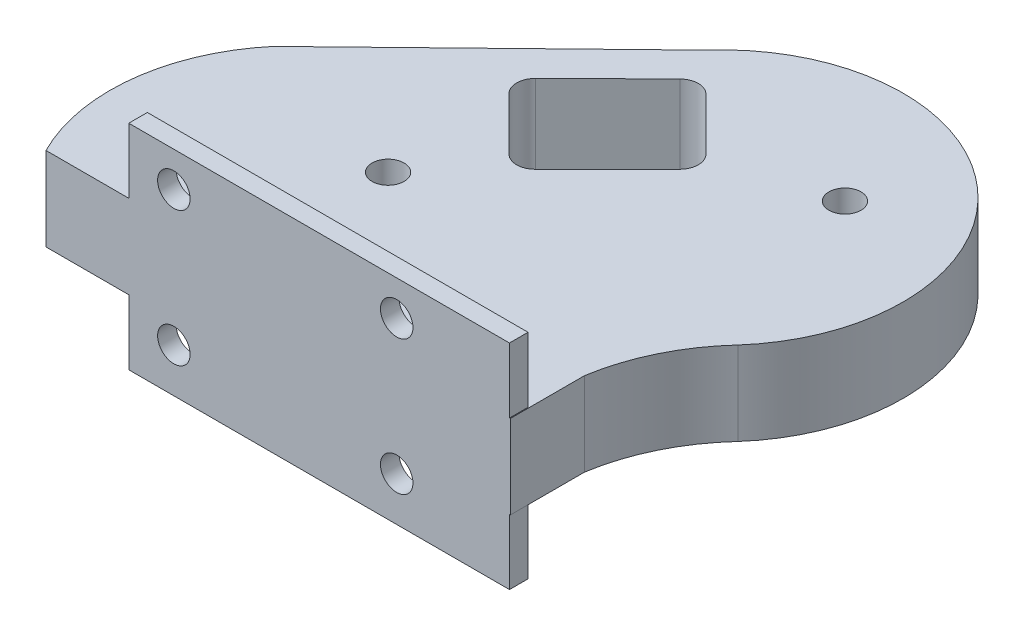
ISO-10303-21;
HEADER;
FILE_DESCRIPTION(('STEP AP214'),'2;1');
FILE_NAME('part.step','',(''),(''),'','','');
FILE_SCHEMA(('AUTOMOTIVE_DESIGN { 1 0 10303 214 1 1 1 1 }'));
ENDSEC;
DATA;
#1=APPLICATION_CONTEXT('core data for automotive mechanical design processes');
#2=APPLICATION_PROTOCOL_DEFINITION('international standard','automotive_design',2000,#1);
#3=PRODUCT_CONTEXT('',#1,'mechanical');
#4=PRODUCT('Part','Part','',(#3));
#5=PRODUCT_RELATED_PRODUCT_CATEGORY('part','',(#4));
#6=PRODUCT_DEFINITION_FORMATION('','',#4);
#7=PRODUCT_DEFINITION_CONTEXT('part definition',#1,'design');
#8=PRODUCT_DEFINITION('design','',#6,#7);
#9=PRODUCT_DEFINITION_SHAPE('','',#8);
#10=(LENGTH_UNIT() NAMED_UNIT(*) SI_UNIT(.MILLI.,.METRE.));
#11=(NAMED_UNIT(*) PLANE_ANGLE_UNIT() SI_UNIT($,.RADIAN.));
#12=(NAMED_UNIT(*) SI_UNIT($,.STERADIAN.) SOLID_ANGLE_UNIT());
#13=UNCERTAINTY_MEASURE_WITH_UNIT(LENGTH_MEASURE(1.E-05),#10,'distance_accuracy_value','');
#14=(GEOMETRIC_REPRESENTATION_CONTEXT(3) GLOBAL_UNCERTAINTY_ASSIGNED_CONTEXT((#13)) GLOBAL_UNIT_ASSIGNED_CONTEXT((#10,
#11,#12)) REPRESENTATION_CONTEXT('',''));
#15=CARTESIAN_POINT('',(0.,0.,0.));
#16=DIRECTION('',(0.,0.,1.));
#17=DIRECTION('',(1.,0.,0.));
#18=AXIS2_PLACEMENT_3D('',#15,#16,#17);
#19=CARTESIAN_POINT('',(17.8501478662486,9.,-9.05723294704562));
#20=DIRECTION('',(0.,-1.,0.));
#21=DIRECTION('',(0.,0.,-1.));
#22=AXIS2_PLACEMENT_3D('',#19,#20,#21);
#23=PLANE('',#22);
#24=DIRECTION('',(0.707106781186548,0.,0.707106781186548));
#25=VECTOR('',#24,1.);
#26=CARTESIAN_POINT('',(26.6861026309434,9.,-23.1742490338568));
#27=LINE('',#26,#25);
#28=CARTESIAN_POINT('',(19.62427187537,9.,-30.2360797894303));
#29=VERTEX_POINT('',#28);
#30=CARTESIAN_POINT('',(25.2718890685703,9.,-24.5884625962299));
#31=VERTEX_POINT('',#30);
#32=EDGE_CURVE('E347',#29,#31,#27,.T.);
#33=ORIENTED_EDGE('',*,*,#32,.F.);
#34=CARTESIAN_POINT('',(21.0384854377431,9.,-31.6502933518034));
#35=DIRECTION('',(0.,-1.,0.));
#36=DIRECTION('',(0.,0.,-1.));
#37=AXIS2_PLACEMENT_3D('',#34,#35,#36);
#38=CIRCLE('',#37,2.);
#39=CARTESIAN_POINT('',(19.6335087359109,9.,-33.0736838348785));
#40=VERTEX_POINT('',#39);
#41=EDGE_CURVE('E318',#29,#40,#38,.T.);
#42=ORIENTED_EDGE('',*,*,#41,.T.);
#43=DIRECTION('',(-0.71169524153756,0.,0.702488350916081));
#44=VECTOR('',#43,1.);
#45=CARTESIAN_POINT('',(18.2008212567049,9.,-31.6595304080954));
#46=LINE('',#45,#44);
#47=CARTESIAN_POINT('',(27.4620960627533,9.,-40.8009961453483));
#48=VERTEX_POINT('',#47);
#49=EDGE_CURVE('E328',#48,#40,#46,.T.);
#50=ORIENTED_EDGE('',*,*,#49,.F.);
#51=CARTESIAN_POINT('',(28.8670727645854,9.,-39.3776056622732));
#52=DIRECTION('',(0.,-1.,0.));
#53=DIRECTION('',(0.,0.,-1.));
#54=AXIS2_PLACEMENT_3D('',#51,#52,#53);
#55=CIRCLE('',#54,2.);
#56=CARTESIAN_POINT('',(30.2812863269585,9.,-40.7918192246463));
#57=VERTEX_POINT('',#56);
#58=EDGE_CURVE('E44',#48,#57,#55,.T.);
#59=ORIENTED_EDGE('',*,*,#58,.T.);
#60=DIRECTION('',(-0.707106781186547,0.,-0.707106781186548));
#61=VECTOR('',#60,1.);
#62=CARTESIAN_POINT('',(28.8762498797683,9.,-42.1968556718366));
#63=LINE('',#62,#61);
#64=CARTESIAN_POINT('',(35.8782660119726,9.,-35.1948395396322));
#65=VERTEX_POINT('',#64);
#66=EDGE_CURVE('E327',#65,#57,#63,.T.);
#67=ORIENTED_EDGE('',*,*,#66,.F.);
#68=CARTESIAN_POINT('',(34.4640524495995,9.,-33.7806259772591));
#69=DIRECTION('',(0.,-1.,0.));
#70=DIRECTION('',(0.,0.,-1.));
#71=AXIS2_PLACEMENT_3D('',#68,#69,#70);
#72=CIRCLE('',#71,2.);
#73=CARTESIAN_POINT('',(35.8782660119726,9.,-32.366412414886));
#74=VERTEX_POINT('',#73);
#75=EDGE_CURVE('E310',#65,#74,#72,.T.);
#76=ORIENTED_EDGE('',*,*,#75,.T.);
#77=DIRECTION('',(0.707106781186547,0.,-0.707106781186548));
#78=VECTOR('',#77,1.);
#79=CARTESIAN_POINT('',(37.2924795743457,9.,-33.7806259772591));
#80=LINE('',#79,#78);
#81=CARTESIAN_POINT('',(28.1003161933165,9.,-24.5884625962299));
#82=VERTEX_POINT('',#81);
#83=EDGE_CURVE('E341',#82,#74,#80,.T.);
#84=ORIENTED_EDGE('',*,*,#83,.F.);
#85=CARTESIAN_POINT('',(26.6861026309434,9.,-26.002676158603));
#86=DIRECTION('',(0.,-1.,0.));
#87=DIRECTION('',(0.,0.,-1.));
#88=AXIS2_PLACEMENT_3D('',#85,#86,#87);
#89=CIRCLE('',#88,2.);
#90=EDGE_CURVE('E314',#82,#31,#89,.T.);
#91=ORIENTED_EDGE('',*,*,#90,.T.);
#92=EDGE_LOOP('',(#33,#42,#50,#59,#67,#76,#84,#91));
#93=FACE_BOUND('',#92,.T.);
#94=CARTESIAN_POINT('',(20.4484847223724,9.,-16.3926586079706));
#95=DIRECTION('',(0.,1.,0.));
#96=DIRECTION('',(0.,0.,1.));
#97=AXIS2_PLACEMENT_3D('',#94,#95,#96);
#98=CIRCLE('',#97,1.725);
#99=CARTESIAN_POINT('',(20.4484847223724,9.,-14.6676586079706));
#100=VERTEX_POINT('',#99);
#101=EDGE_CURVE('E356',#100,#100,#98,.T.);
#102=ORIENTED_EDGE('',*,*,#101,.F.);
#103=EDGE_LOOP('',(#102));
#104=FACE_BOUND('',#103,.T.);
#105=CARTESIAN_POINT('',(47.7410163395076,9.,-38.3042472753328));
#106=DIRECTION('',(0.,1.,0.));
#107=DIRECTION('',(0.,0.,1.));
#108=AXIS2_PLACEMENT_3D('',#105,#106,#107);
#109=CIRCLE('',#108,1.725);
#110=CARTESIAN_POINT('',(47.7410163395076,9.,-36.5792472753328));
#111=VERTEX_POINT('',#110);
#112=EDGE_CURVE('E353',#111,#111,#109,.T.);
#113=ORIENTED_EDGE('',*,*,#112,.F.);
#114=EDGE_LOOP('',(#113));
#115=FACE_BOUND('',#114,.T.);
#116=DIRECTION('',(0.,0.,1.));
#117=VECTOR('',#116,1.);
#118=CARTESIAN_POINT('',(8.9130109246541,9.,-2.));
#119=LINE('',#118,#117);
#120=CARTESIAN_POINT('',(8.9130109246541,9.,-2.));
#121=VERTEX_POINT('',#120);
#122=CARTESIAN_POINT('',(8.9130109246541,9.,0.));
#123=VERTEX_POINT('',#122);
#124=EDGE_CURVE('E201',#121,#123,#119,.T.);
#125=ORIENTED_EDGE('',*,*,#124,.F.);
#126=DIRECTION('',(1.,0.,0.));
#127=VECTOR('',#126,1.);
#128=CARTESIAN_POINT('',(8.9130109246541,9.,-2.));
#129=LINE('',#128,#127);
#130=CARTESIAN_POINT('',(49.9130109246541,9.00000000000001,-2.));
#131=VERTEX_POINT('',#130);
#132=EDGE_CURVE('E186',#121,#131,#129,.T.);
#133=ORIENTED_EDGE('',*,*,#132,.T.);
#134=DIRECTION('',(0.,0.,1.));
#135=VECTOR('',#134,1.);
#136=CARTESIAN_POINT('',(49.9130109246541,9.00000000000001,-2.));
#137=LINE('',#136,#135);
#138=CARTESIAN_POINT('',(49.9130109246541,9.,0.));
#139=VERTEX_POINT('',#138);
#140=EDGE_CURVE('E209',#131,#139,#137,.T.);
#141=ORIENTED_EDGE('',*,*,#140,.T.);
#142=DIRECTION('',(1.,0.,0.));
#143=VECTOR('',#142,1.);
#144=CARTESIAN_POINT('',(0.,9.,0.));
#145=LINE('',#144,#143);
#146=CARTESIAN_POINT('',(50.,9.,0.));
#147=VERTEX_POINT('',#146);
#148=EDGE_CURVE('E249',#139,#147,#145,.T.);
#149=ORIENTED_EDGE('',*,*,#148,.T.);
#150=DIRECTION('',(0.,0.,-1.));
#151=VECTOR('',#150,1.);
#152=CARTESIAN_POINT('',(50.,9.,0.));
#153=LINE('',#152,#151);
#154=CARTESIAN_POINT('',(50.,9.,-8.));
#155=VERTEX_POINT('',#154);
#156=EDGE_CURVE('E252',#147,#155,#153,.T.);
#157=ORIENTED_EDGE('',*,*,#156,.T.);
#158=CARTESIAN_POINT('',(71.175111147569,9.,-4.5795657374805));
#159=DIRECTION('',(0.,-1.,0.));
#160=DIRECTION('',(0.,0.,-1.));
#161=AXIS2_PLACEMENT_3D('',#158,#159,#160);
#162=CIRCLE('',#161,21.4495851394874);
#163=CARTESIAN_POINT('',(55.3975684306176,9.,-19.1106995016054));
#164=VERTEX_POINT('',#163);
#165=EDGE_CURVE('E254',#155,#164,#162,.T.);
#166=ORIENTED_EDGE('',*,*,#165,.T.);
#167=CARTESIAN_POINT('',(40.8067017302212,9.,-32.0203140719151));
#168=DIRECTION('',(0.,1.,0.));
#169=DIRECTION('',(0.,0.,-1.));
#170=AXIS2_PLACEMENT_3D('',#167,#168,#169);
#171=CIRCLE('',#170,19.4820825227358);
#172=CARTESIAN_POINT('',(26.2158350298248,9.,-44.9299286422246));
#173=VERTEX_POINT('',#172);
#174=EDGE_CURVE('E256',#164,#173,#171,.T.);
#175=ORIENTED_EDGE('',*,*,#174,.T.);
#176=DIRECTION('',(-0.717581512482861,0.,0.696474531438738));
#177=VECTOR('',#176,1.);
#178=CARTESIAN_POINT('',(2.53564511789033,9.,-21.9462691047463));
#179=LINE('',#178,#177);
#180=CARTESIAN_POINT('',(2.53564511789033,9.,-21.9462691047463));
#181=VERTEX_POINT('',#180);
#182=EDGE_CURVE('E258',#173,#181,#179,.T.);
#183=ORIENTED_EDGE('',*,*,#182,.T.);
#184=CARTESIAN_POINT('',(17.8501478662486,9.,-9.05723294704562));
#185=DIRECTION('',(0.,1.,0.));
#186=DIRECTION('',(0.,0.,-1.));
#187=AXIS2_PLACEMENT_3D('',#184,#185,#186);
#188=CIRCLE('',#187,20.0165243612368);
#189=CARTESIAN_POINT('',(0.,9.,0.));
#190=VERTEX_POINT('',#189);
#191=EDGE_CURVE('E247',#181,#190,#188,.T.);
#192=ORIENTED_EDGE('',*,*,#191,.T.);
#193=EDGE_CURVE('E208',#190,#123,#145,.T.);
#194=ORIENTED_EDGE('',*,*,#193,.T.);
#195=EDGE_LOOP('',(#125,#133,#141,#149,#157,#166,#175,#183,#192,#194));
#196=FACE_BOUND('',#195,.T.);
#197=ADVANCED_FACE('F36',(#93,#104,#115,#196),#23,.F.);
#198=CARTESIAN_POINT('',(17.8501478662486,9.,-9.05723294704562));
#199=DIRECTION('',(0.,-1.,0.));
#200=DIRECTION('',(0.,0.,-1.));
#201=AXIS2_PLACEMENT_3D('',#198,#199,#200);
#202=CYLINDRICAL_SURFACE('',#201,20.0165243612368);
#203=CARTESIAN_POINT('',(17.8501478662486,0.,-9.05723294704562));
#204=DIRECTION('',(0.,1.,0.));
#205=DIRECTION('',(0.,0.,-1.));
#206=AXIS2_PLACEMENT_3D('',#203,#204,#205);
#207=CIRCLE('',#206,20.0165243612368);
#208=CARTESIAN_POINT('',(2.53564511789033,0.,-21.9462691047463));
#209=VERTEX_POINT('',#208);
#210=CARTESIAN_POINT('',(0.,0.,0.));
#211=VERTEX_POINT('',#210);
#212=EDGE_CURVE('E241',#209,#211,#207,.T.);
#213=ORIENTED_EDGE('',*,*,#212,.T.);
#214=DIRECTION('',(0.,-1.,0.));
#215=VECTOR('',#214,1.);
#216=CARTESIAN_POINT('',(0.,9.,0.));
#217=LINE('',#216,#215);
#218=EDGE_CURVE('E288',#190,#211,#217,.T.);
#219=ORIENTED_EDGE('',*,*,#218,.F.);
#220=ORIENTED_EDGE('',*,*,#191,.F.);
#221=DIRECTION('',(0.,-1.,0.));
#222=VECTOR('',#221,1.);
#223=CARTESIAN_POINT('',(2.53564511789033,9.,-21.9462691047463));
#224=LINE('',#223,#222);
#225=EDGE_CURVE('E260',#181,#209,#224,.T.);
#226=ORIENTED_EDGE('',*,*,#225,.T.);
#227=EDGE_LOOP('',(#213,#219,#220,#226));
#228=FACE_BOUND('',#227,.T.);
#229=ADVANCED_FACE('F413',(#228),#202,.T.);
#230=CARTESIAN_POINT('',(0.,9.,0.));
#231=DIRECTION('',(0.,0.,-1.));
#232=DIRECTION('',(-1.,0.,0.));
#233=AXIS2_PLACEMENT_3D('',#230,#231,#232);
#234=PLANE('',#233);
#235=CARTESIAN_POINT('',(13.7694483975875,12.2365251411092,0.));
#236=DIRECTION('',(0.,0.,-1.));
#237=DIRECTION('',(-1.,0.,0.));
#238=AXIS2_PLACEMENT_3D('',#235,#236,#237);
#239=CIRCLE('',#238,1.75);
#240=CARTESIAN_POINT('',(12.0194483975875,12.2365251411092,0.));
#241=VERTEX_POINT('',#240);
#242=EDGE_CURVE('E381',#241,#241,#239,.T.);
#243=ORIENTED_EDGE('',*,*,#242,.T.);
#244=EDGE_LOOP('',(#243));
#245=FACE_BOUND('',#244,.T.);
#246=CARTESIAN_POINT('',(37.7694483975875,12.236525141109,0.));
#247=DIRECTION('',(0.,0.,-1.));
#248=DIRECTION('',(-1.,0.,0.));
#249=AXIS2_PLACEMENT_3D('',#246,#247,#248);
#250=CIRCLE('',#249,1.75);
#251=CARTESIAN_POINT('',(36.0194483975875,12.236525141109,0.));
#252=VERTEX_POINT('',#251);
#253=EDGE_CURVE('E375',#252,#252,#250,.T.);
#254=ORIENTED_EDGE('',*,*,#253,.T.);
#255=EDGE_LOOP('',(#254));
#256=FACE_BOUND('',#255,.T.);
#257=CARTESIAN_POINT('',(37.7694483975874,-2.26347485889099,0.));
#258=DIRECTION('',(0.,0.,-1.));
#259=DIRECTION('',(-1.,0.,0.));
#260=AXIS2_PLACEMENT_3D('',#257,#258,#259);
#261=CIRCLE('',#260,1.75);
#262=CARTESIAN_POINT('',(36.0194483975874,-2.26347485889099,0.));
#263=VERTEX_POINT('',#262);
#264=EDGE_CURVE('E368',#263,#263,#261,.T.);
#265=ORIENTED_EDGE('',*,*,#264,.T.);
#266=EDGE_LOOP('',(#265));
#267=FACE_BOUND('',#266,.T.);
#268=CARTESIAN_POINT('',(13.7694483975874,-2.26347485889082,0.));
#269=DIRECTION('',(0.,0.,-1.));
#270=DIRECTION('',(-1.,0.,0.));
#271=AXIS2_PLACEMENT_3D('',#268,#269,#270);
#272=CIRCLE('',#271,1.75);
#273=CARTESIAN_POINT('',(12.0194483975874,-2.26347485889082,0.));
#274=VERTEX_POINT('',#273);
#275=EDGE_CURVE('E386',#274,#274,#272,.T.);
#276=ORIENTED_EDGE('',*,*,#275,.T.);
#277=EDGE_LOOP('',(#276));
#278=FACE_BOUND('',#277,.T.);
#279=DIRECTION('',(1.,0.,0.));
#280=VECTOR('',#279,1.);
#281=CARTESIAN_POINT('',(0.,0.,0.));
#282=LINE('',#281,#280);
#283=CARTESIAN_POINT('',(8.9130109246541,0.,0.));
#284=VERTEX_POINT('',#283);
#285=EDGE_CURVE('E264',#211,#284,#282,.T.);
#286=ORIENTED_EDGE('',*,*,#285,.T.);
#287=DIRECTION('',(0.,-1.,0.));
#288=VECTOR('',#287,1.);
#289=CARTESIAN_POINT('',(8.9130109246541,-7.,0.));
#290=LINE('',#289,#288);
#291=CARTESIAN_POINT('',(8.9130109246541,-7.,0.));
#292=VERTEX_POINT('',#291);
#293=EDGE_CURVE('E230',#284,#292,#290,.T.);
#294=ORIENTED_EDGE('',*,*,#293,.T.);
#295=DIRECTION('',(1.,0.,0.));
#296=VECTOR('',#295,1.);
#297=CARTESIAN_POINT('',(8.9130109246541,-7.,0.));
#298=LINE('',#297,#296);
#299=CARTESIAN_POINT('',(49.9130109246541,-7.,0.));
#300=VERTEX_POINT('',#299);
#301=EDGE_CURVE('E233',#292,#300,#298,.T.);
#302=ORIENTED_EDGE('',*,*,#301,.T.);
#303=DIRECTION('',(0.,1.,0.));
#304=VECTOR('',#303,1.);
#305=CARTESIAN_POINT('',(49.9130109246541,-7.,0.));
#306=LINE('',#305,#304);
#307=CARTESIAN_POINT('',(49.9130109246541,0.,0.));
#308=VERTEX_POINT('',#307);
#309=EDGE_CURVE('E221',#300,#308,#306,.T.);
#310=ORIENTED_EDGE('',*,*,#309,.T.);
#311=CARTESIAN_POINT('',(50.,0.,0.));
#312=VERTEX_POINT('',#311);
#313=EDGE_CURVE('E263',#308,#312,#282,.T.);
#314=ORIENTED_EDGE('',*,*,#313,.T.);
#315=DIRECTION('',(0.,-1.,0.));
#316=VECTOR('',#315,1.);
#317=CARTESIAN_POINT('',(50.,9.,0.));
#318=LINE('',#317,#316);
#319=EDGE_CURVE('E285',#147,#312,#318,.T.);
#320=ORIENTED_EDGE('',*,*,#319,.F.);
#321=ORIENTED_EDGE('',*,*,#148,.F.);
#322=DIRECTION('',(0.,1.,0.));
#323=VECTOR('',#322,1.);
#324=CARTESIAN_POINT('',(49.9130109246541,16.,0.));
#325=LINE('',#324,#323);
#326=CARTESIAN_POINT('',(49.9130109246541,16.,0.));
#327=VERTEX_POINT('',#326);
#328=EDGE_CURVE('E394',#139,#327,#325,.T.);
#329=ORIENTED_EDGE('',*,*,#328,.T.);
#330=DIRECTION('',(-1.,0.,0.));
#331=VECTOR('',#330,1.);
#332=CARTESIAN_POINT('',(8.9130109246541,16.,0.));
#333=LINE('',#332,#331);
#334=CARTESIAN_POINT('',(8.9130109246541,16.,0.));
#335=VERTEX_POINT('',#334);
#336=EDGE_CURVE('E204',#327,#335,#333,.T.);
#337=ORIENTED_EDGE('',*,*,#336,.T.);
#338=DIRECTION('',(0.,-1.,0.));
#339=VECTOR('',#338,1.);
#340=CARTESIAN_POINT('',(8.9130109246541,16.,0.));
#341=LINE('',#340,#339);
#342=EDGE_CURVE('E389',#335,#123,#341,.T.);
#343=ORIENTED_EDGE('',*,*,#342,.T.);
#344=ORIENTED_EDGE('',*,*,#193,.F.);
#345=ORIENTED_EDGE('',*,*,#218,.T.);
#346=EDGE_LOOP('',(#286,#294,#302,#310,#314,#320,#321,#329,#337,#343,#344,#345));
#347=FACE_BOUND('',#346,.T.);
#348=ADVANCED_FACE('F405',(#245,#256,#267,#278,#347),#234,.F.);
#349=CARTESIAN_POINT('',(50.,9.,0.));
#350=DIRECTION('',(-1.,0.,0.));
#351=DIRECTION('',(0.,0.,1.));
#352=AXIS2_PLACEMENT_3D('',#349,#350,#351);
#353=PLANE('',#352);
#354=DIRECTION('',(0.,0.,-1.));
#355=VECTOR('',#354,1.);
#356=CARTESIAN_POINT('',(50.,0.,0.));
#357=LINE('',#356,#355);
#358=CARTESIAN_POINT('',(50.,0.,-8.));
#359=VERTEX_POINT('',#358);
#360=EDGE_CURVE('E267',#312,#359,#357,.T.);
#361=ORIENTED_EDGE('',*,*,#360,.T.);
#362=DIRECTION('',(0.,-1.,0.));
#363=VECTOR('',#362,1.);
#364=CARTESIAN_POINT('',(50.,9.,-8.));
#365=LINE('',#364,#363);
#366=EDGE_CURVE('E282',#155,#359,#365,.T.);
#367=ORIENTED_EDGE('',*,*,#366,.F.);
#368=ORIENTED_EDGE('',*,*,#156,.F.);
#369=ORIENTED_EDGE('',*,*,#319,.T.);
#370=EDGE_LOOP('',(#361,#367,#368,#369));
#371=FACE_BOUND('',#370,.T.);
#372=ADVANCED_FACE('F436',(#371),#353,.F.);
#373=CARTESIAN_POINT('',(71.175111147569,9.,-4.5795657374805));
#374=DIRECTION('',(0.,-1.,0.));
#375=DIRECTION('',(0.,0.,-1.));
#376=AXIS2_PLACEMENT_3D('',#373,#374,#375);
#377=CYLINDRICAL_SURFACE('',#376,21.4495851394874);
#378=CARTESIAN_POINT('',(71.175111147569,0.,-4.5795657374805));
#379=DIRECTION('',(0.,-1.,0.));
#380=DIRECTION('',(0.,0.,-1.));
#381=AXIS2_PLACEMENT_3D('',#378,#379,#380);
#382=CIRCLE('',#381,21.4495851394874);
#383=CARTESIAN_POINT('',(55.3975684306176,0.,-19.1106995016054));
#384=VERTEX_POINT('',#383);
#385=EDGE_CURVE('E269',#359,#384,#382,.T.);
#386=ORIENTED_EDGE('',*,*,#385,.T.);
#387=DIRECTION('',(0.,-1.,0.));
#388=VECTOR('',#387,1.);
#389=CARTESIAN_POINT('',(55.3975684306176,9.,-19.1106995016054));
#390=LINE('',#389,#388);
#391=EDGE_CURVE('E279',#164,#384,#390,.T.);
#392=ORIENTED_EDGE('',*,*,#391,.F.);
#393=ORIENTED_EDGE('',*,*,#165,.F.);
#394=ORIENTED_EDGE('',*,*,#366,.T.);
#395=EDGE_LOOP('',(#386,#392,#393,#394));
#396=FACE_BOUND('',#395,.T.);
#397=ADVANCED_FACE('F440',(#396),#377,.F.);
#398=CARTESIAN_POINT('',(40.8067017302212,9.,-32.0203140719151));
#399=DIRECTION('',(0.,-1.,0.));
#400=DIRECTION('',(0.,0.,-1.));
#401=AXIS2_PLACEMENT_3D('',#398,#399,#400);
#402=CYLINDRICAL_SURFACE('',#401,19.4820825227358);
#403=CARTESIAN_POINT('',(40.8067017302212,0.,-32.0203140719151));
#404=DIRECTION('',(0.,1.,0.));
#405=DIRECTION('',(0.,0.,-1.));
#406=AXIS2_PLACEMENT_3D('',#403,#404,#405);
#407=CIRCLE('',#406,19.4820825227358);
#408=CARTESIAN_POINT('',(26.2158350298248,0.,-44.9299286422246));
#409=VERTEX_POINT('',#408);
#410=EDGE_CURVE('E271',#384,#409,#407,.T.);
#411=ORIENTED_EDGE('',*,*,#410,.T.);
#412=DIRECTION('',(0.,-1.,0.));
#413=VECTOR('',#412,1.);
#414=CARTESIAN_POINT('',(26.2158350298248,9.,-44.9299286422246));
#415=LINE('',#414,#413);
#416=EDGE_CURVE('E276',#173,#409,#415,.T.);
#417=ORIENTED_EDGE('',*,*,#416,.F.);
#418=ORIENTED_EDGE('',*,*,#174,.F.);
#419=ORIENTED_EDGE('',*,*,#391,.T.);
#420=EDGE_LOOP('',(#411,#417,#418,#419));
#421=FACE_BOUND('',#420,.T.);
#422=ADVANCED_FACE('F445',(#421),#402,.T.);
#423=CARTESIAN_POINT('',(2.53564511789033,9.,-21.9462691047463));
#424=DIRECTION('',(0.696474531438738,0.,0.717581512482861));
#425=DIRECTION('',(0.717581512482861,0.,-0.696474531438738));
#426=AXIS2_PLACEMENT_3D('',#423,#424,#425);
#427=PLANE('',#426);
#428=DIRECTION('',(-0.717581512482861,0.,0.696474531438738));
#429=VECTOR('',#428,1.);
#430=CARTESIAN_POINT('',(2.53564511789033,0.,-21.9462691047463));
#431=LINE('',#430,#429);
#432=EDGE_CURVE('E250',#409,#209,#431,.T.);
#433=ORIENTED_EDGE('',*,*,#432,.T.);
#434=ORIENTED_EDGE('',*,*,#225,.F.);
#435=ORIENTED_EDGE('',*,*,#182,.F.);
#436=ORIENTED_EDGE('',*,*,#416,.T.);
#437=EDGE_LOOP('',(#433,#434,#435,#436));
#438=FACE_BOUND('',#437,.T.);
#439=ADVANCED_FACE('F447',(#438),#427,.F.);
#440=CARTESIAN_POINT('',(17.8501478662486,0.,-9.05723294704562));
#441=DIRECTION('',(0.,-1.,0.));
#442=DIRECTION('',(0.,0.,-1.));
#443=AXIS2_PLACEMENT_3D('',#440,#441,#442);
#444=PLANE('',#443);
#445=DIRECTION('',(-0.707106781186547,0.,-0.707106781186548));
#446=VECTOR('',#445,1.);
#447=CARTESIAN_POINT('',(28.8762498797683,0.,-42.1968556718366));
#448=LINE('',#447,#446);
#449=CARTESIAN_POINT('',(35.8782660119726,0.,-35.1948395396322));
#450=VERTEX_POINT('',#449);
#451=CARTESIAN_POINT('',(30.2812863269585,0.,-40.7918192246463));
#452=VERTEX_POINT('',#451);
#453=EDGE_CURVE('E351',#450,#452,#448,.T.);
#454=ORIENTED_EDGE('',*,*,#453,.T.);
#455=CARTESIAN_POINT('',(28.8670727645854,0.,-39.3776056622732));
#456=DIRECTION('',(0.,-1.,0.));
#457=DIRECTION('',(0.,0.,-1.));
#458=AXIS2_PLACEMENT_3D('',#455,#456,#457);
#459=CIRCLE('',#458,2.);
#460=CARTESIAN_POINT('',(27.4620960627533,0.,-40.8009961453483));
#461=VERTEX_POINT('',#460);
#462=EDGE_CURVE('E11',#452,#461,#459,.F.);
#463=ORIENTED_EDGE('',*,*,#462,.T.);
#464=DIRECTION('',(-0.71169524153756,0.,0.702488350916081));
#465=VECTOR('',#464,1.);
#466=CARTESIAN_POINT('',(18.2008212567049,0.,-31.6595304080954));
#467=LINE('',#466,#465);
#468=CARTESIAN_POINT('',(19.6335087359109,0.,-33.0736838348785));
#469=VERTEX_POINT('',#468);
#470=EDGE_CURVE('E338',#461,#469,#467,.T.);
#471=ORIENTED_EDGE('',*,*,#470,.T.);
#472=CARTESIAN_POINT('',(21.0384854377431,0.,-31.6502933518034));
#473=DIRECTION('',(0.,-1.,0.));
#474=DIRECTION('',(0.,0.,-1.));
#475=AXIS2_PLACEMENT_3D('',#472,#473,#474);
#476=CIRCLE('',#475,2.);
#477=CARTESIAN_POINT('',(19.62427187537,0.,-30.2360797894303));
#478=VERTEX_POINT('',#477);
#479=EDGE_CURVE('E320',#469,#478,#476,.F.);
#480=ORIENTED_EDGE('',*,*,#479,.T.);
#481=DIRECTION('',(0.707106781186548,0.,0.707106781186548));
#482=VECTOR('',#481,1.);
#483=CARTESIAN_POINT('',(26.6861026309434,0.,-23.1742490338568));
#484=LINE('',#483,#482);
#485=CARTESIAN_POINT('',(25.2718890685703,0.,-24.5884625962299));
#486=VERTEX_POINT('',#485);
#487=EDGE_CURVE('E340',#478,#486,#484,.T.);
#488=ORIENTED_EDGE('',*,*,#487,.T.);
#489=CARTESIAN_POINT('',(26.6861026309434,0.,-26.002676158603));
#490=DIRECTION('',(0.,-1.,0.));
#491=DIRECTION('',(0.,0.,-1.));
#492=AXIS2_PLACEMENT_3D('',#489,#490,#491);
#493=CIRCLE('',#492,2.);
#494=CARTESIAN_POINT('',(28.1003161933165,0.,-24.5884625962299));
#495=VERTEX_POINT('',#494);
#496=EDGE_CURVE('E316',#486,#495,#493,.F.);
#497=ORIENTED_EDGE('',*,*,#496,.T.);
#498=DIRECTION('',(0.707106781186547,0.,-0.707106781186548));
#499=VECTOR('',#498,1.);
#500=CARTESIAN_POINT('',(37.2924795743457,0.,-33.7806259772591));
#501=LINE('',#500,#499);
#502=CARTESIAN_POINT('',(35.8782660119726,0.,-32.366412414886));
#503=VERTEX_POINT('',#502);
#504=EDGE_CURVE('E344',#495,#503,#501,.T.);
#505=ORIENTED_EDGE('',*,*,#504,.T.);
#506=CARTESIAN_POINT('',(34.4640524495995,0.,-33.7806259772591));
#507=DIRECTION('',(0.,-1.,0.));
#508=DIRECTION('',(0.,0.,-1.));
#509=AXIS2_PLACEMENT_3D('',#506,#507,#508);
#510=CIRCLE('',#509,2.);
#511=EDGE_CURVE('E312',#503,#450,#510,.F.);
#512=ORIENTED_EDGE('',*,*,#511,.T.);
#513=EDGE_LOOP('',(#454,#463,#471,#480,#488,#497,#505,#512));
#514=FACE_BOUND('',#513,.T.);
#515=CARTESIAN_POINT('',(20.4484847223724,0.,-16.3926586079706));
#516=DIRECTION('',(0.,-1.,0.));
#517=DIRECTION('',(0.,0.,-1.));
#518=AXIS2_PLACEMENT_3D('',#515,#516,#517);
#519=CIRCLE('',#518,1.725);
#520=CARTESIAN_POINT('',(20.4484847223724,0.,-18.1176586079706));
#521=VERTEX_POINT('',#520);
#522=EDGE_CURVE('E359',#521,#521,#519,.F.);
#523=ORIENTED_EDGE('',*,*,#522,.T.);
#524=EDGE_LOOP('',(#523));
#525=FACE_BOUND('',#524,.T.);
#526=CARTESIAN_POINT('',(47.7410163395076,0.,-38.3042472753328));
#527=DIRECTION('',(0.,-1.,0.));
#528=DIRECTION('',(0.,0.,-1.));
#529=AXIS2_PLACEMENT_3D('',#526,#527,#528);
#530=CIRCLE('',#529,1.725);
#531=CARTESIAN_POINT('',(47.7410163395076,0.,-40.0292472753328));
#532=VERTEX_POINT('',#531);
#533=EDGE_CURVE('E360',#532,#532,#530,.F.);
#534=ORIENTED_EDGE('',*,*,#533,.T.);
#535=EDGE_LOOP('',(#534));
#536=FACE_BOUND('',#535,.T.);
#537=DIRECTION('',(0.,0.,1.));
#538=VECTOR('',#537,1.);
#539=CARTESIAN_POINT('',(49.9130109246541,0.,-2.));
#540=LINE('',#539,#538);
#541=CARTESIAN_POINT('',(49.9130109246541,0.,-2.));
#542=VERTEX_POINT('',#541);
#543=EDGE_CURVE('E242',#542,#308,#540,.T.);
#544=ORIENTED_EDGE('',*,*,#543,.F.);
#545=DIRECTION('',(-1.,0.,0.));
#546=VECTOR('',#545,1.);
#547=CARTESIAN_POINT('',(8.9130109246541,0.,-2.));
#548=LINE('',#547,#546);
#549=CARTESIAN_POINT('',(8.9130109246541,0.,-2.));
#550=VERTEX_POINT('',#549);
#551=EDGE_CURVE('E226',#542,#550,#548,.T.);
#552=ORIENTED_EDGE('',*,*,#551,.T.);
#553=DIRECTION('',(0.,0.,1.));
#554=VECTOR('',#553,1.);
#555=CARTESIAN_POINT('',(8.9130109246541,0.,-2.));
#556=LINE('',#555,#554);
#557=EDGE_CURVE('E238',#550,#284,#556,.T.);
#558=ORIENTED_EDGE('',*,*,#557,.T.);
#559=ORIENTED_EDGE('',*,*,#285,.F.);
#560=ORIENTED_EDGE('',*,*,#212,.F.);
#561=ORIENTED_EDGE('',*,*,#432,.F.);
#562=ORIENTED_EDGE('',*,*,#410,.F.);
#563=ORIENTED_EDGE('',*,*,#385,.F.);
#564=ORIENTED_EDGE('',*,*,#360,.F.);
#565=ORIENTED_EDGE('',*,*,#313,.F.);
#566=EDGE_LOOP('',(#544,#552,#558,#559,#560,#561,#562,#563,#564,#565));
#567=FACE_BOUND('',#566,.T.);
#568=ADVANCED_FACE('F418',(#514,#525,#536,#567),#444,.T.);
#569=CARTESIAN_POINT('',(8.9130109246541,-7.,-2.));
#570=DIRECTION('',(-1.,0.,0.));
#571=DIRECTION('',(0.,0.,1.));
#572=AXIS2_PLACEMENT_3D('',#569,#570,#571);
#573=PLANE('',#572);
#574=ORIENTED_EDGE('',*,*,#293,.F.);
#575=ORIENTED_EDGE('',*,*,#557,.F.);
#576=DIRECTION('',(0.,-1.,0.));
#577=VECTOR('',#576,1.);
#578=CARTESIAN_POINT('',(8.9130109246541,-7.,-2.));
#579=LINE('',#578,#577);
#580=CARTESIAN_POINT('',(8.9130109246541,-7.,-2.));
#581=VERTEX_POINT('',#580);
#582=EDGE_CURVE('E217',#550,#581,#579,.T.);
#583=ORIENTED_EDGE('',*,*,#582,.T.);
#584=DIRECTION('',(0.,0.,1.));
#585=VECTOR('',#584,1.);
#586=CARTESIAN_POINT('',(8.9130109246541,-7.,-2.));
#587=LINE('',#586,#585);
#588=EDGE_CURVE('E229',#581,#292,#587,.T.);
#589=ORIENTED_EDGE('',*,*,#588,.T.);
#590=EDGE_LOOP('',(#574,#575,#583,#589));
#591=FACE_BOUND('',#590,.T.);
#592=ADVANCED_FACE('F422',(#591),#573,.T.);
#593=CARTESIAN_POINT('',(49.9130109246541,-7.,-2.));
#594=DIRECTION('',(1.,0.,0.));
#595=DIRECTION('',(0.,0.,-1.));
#596=AXIS2_PLACEMENT_3D('',#593,#594,#595);
#597=PLANE('',#596);
#598=ORIENTED_EDGE('',*,*,#309,.F.);
#599=DIRECTION('',(0.,0.,1.));
#600=VECTOR('',#599,1.);
#601=CARTESIAN_POINT('',(49.9130109246541,-7.,-2.));
#602=LINE('',#601,#600);
#603=CARTESIAN_POINT('',(49.9130109246541,-7.,-2.));
#604=VERTEX_POINT('',#603);
#605=EDGE_CURVE('E244',#604,#300,#602,.T.);
#606=ORIENTED_EDGE('',*,*,#605,.F.);
#607=DIRECTION('',(0.,1.,0.));
#608=VECTOR('',#607,1.);
#609=CARTESIAN_POINT('',(49.9130109246541,-7.,-2.));
#610=LINE('',#609,#608);
#611=EDGE_CURVE('E224',#604,#542,#610,.T.);
#612=ORIENTED_EDGE('',*,*,#611,.T.);
#613=ORIENTED_EDGE('',*,*,#543,.T.);
#614=EDGE_LOOP('',(#598,#606,#612,#613));
#615=FACE_BOUND('',#614,.T.);
#616=ADVANCED_FACE('F430',(#615),#597,.T.);
#617=CARTESIAN_POINT('',(8.9130109246541,-7.,-2.));
#618=DIRECTION('',(0.,-1.,0.));
#619=DIRECTION('',(0.,0.,-1.));
#620=AXIS2_PLACEMENT_3D('',#617,#618,#619);
#621=PLANE('',#620);
#622=ORIENTED_EDGE('',*,*,#301,.F.);
#623=ORIENTED_EDGE('',*,*,#588,.F.);
#624=DIRECTION('',(1.,0.,0.));
#625=VECTOR('',#624,1.);
#626=CARTESIAN_POINT('',(8.9130109246541,-7.,-2.));
#627=LINE('',#626,#625);
#628=EDGE_CURVE('E220',#581,#604,#627,.T.);
#629=ORIENTED_EDGE('',*,*,#628,.T.);
#630=ORIENTED_EDGE('',*,*,#605,.T.);
#631=EDGE_LOOP('',(#622,#623,#629,#630));
#632=FACE_BOUND('',#631,.T.);
#633=ADVANCED_FACE('F426',(#632),#621,.T.);
#634=CARTESIAN_POINT('',(0.,0.,-2.));
#635=DIRECTION('',(0.,0.,-1.));
#636=DIRECTION('',(-1.,0.,0.));
#637=AXIS2_PLACEMENT_3D('',#634,#635,#636);
#638=PLANE('',#637);
#639=CARTESIAN_POINT('',(37.7694483975874,-2.26347485889099,-2.));
#640=DIRECTION('',(0.,0.,-1.));
#641=DIRECTION('',(-1.,0.,0.));
#642=AXIS2_PLACEMENT_3D('',#639,#640,#641);
#643=CIRCLE('',#642,1.75);
#644=CARTESIAN_POINT('',(36.0194483975874,-2.26347485889099,-2.));
#645=VERTEX_POINT('',#644);
#646=EDGE_CURVE('E372',#645,#645,#643,.T.);
#647=ORIENTED_EDGE('',*,*,#646,.F.);
#648=EDGE_LOOP('',(#647));
#649=FACE_BOUND('',#648,.T.);
#650=CARTESIAN_POINT('',(13.7694483975874,-2.26347485889082,-2.));
#651=DIRECTION('',(0.,0.,-1.));
#652=DIRECTION('',(-1.,0.,0.));
#653=AXIS2_PLACEMENT_3D('',#650,#651,#652);
#654=CIRCLE('',#653,1.75);
#655=CARTESIAN_POINT('',(12.0194483975874,-2.26347485889082,-2.));
#656=VERTEX_POINT('',#655);
#657=EDGE_CURVE('E371',#656,#656,#654,.T.);
#658=ORIENTED_EDGE('',*,*,#657,.F.);
#659=EDGE_LOOP('',(#658));
#660=FACE_BOUND('',#659,.T.);
#661=ORIENTED_EDGE('',*,*,#582,.F.);
#662=ORIENTED_EDGE('',*,*,#551,.F.);
#663=ORIENTED_EDGE('',*,*,#611,.F.);
#664=ORIENTED_EDGE('',*,*,#628,.F.);
#665=EDGE_LOOP('',(#661,#662,#663,#664));
#666=FACE_BOUND('',#665,.T.);
#667=ADVANCED_FACE('F467',(#649,#660,#666),#638,.T.);
#668=CARTESIAN_POINT('',(8.9130109246541,16.,-2.));
#669=DIRECTION('',(-1.,0.,0.));
#670=DIRECTION('',(0.,-1.,0.));
#671=AXIS2_PLACEMENT_3D('',#668,#669,#670);
#672=PLANE('',#671);
#673=ORIENTED_EDGE('',*,*,#342,.F.);
#674=DIRECTION('',(0.,0.,1.));
#675=VECTOR('',#674,1.);
#676=CARTESIAN_POINT('',(8.9130109246541,16.,-2.));
#677=LINE('',#676,#675);
#678=CARTESIAN_POINT('',(8.9130109246541,16.,-2.));
#679=VERTEX_POINT('',#678);
#680=EDGE_CURVE('E203',#679,#335,#677,.T.);
#681=ORIENTED_EDGE('',*,*,#680,.F.);
#682=DIRECTION('',(0.,-1.,0.));
#683=VECTOR('',#682,1.);
#684=CARTESIAN_POINT('',(8.9130109246541,16.,-2.));
#685=LINE('',#684,#683);
#686=EDGE_CURVE('E190',#679,#121,#685,.T.);
#687=ORIENTED_EDGE('',*,*,#686,.T.);
#688=ORIENTED_EDGE('',*,*,#124,.T.);
#689=EDGE_LOOP('',(#673,#681,#687,#688));
#690=FACE_BOUND('',#689,.T.);
#691=ADVANCED_FACE('F200',(#690),#672,.T.);
#692=CARTESIAN_POINT('',(8.9130109246541,16.,-2.));
#693=DIRECTION('',(0.,1.,0.));
#694=DIRECTION('',(-1.,0.,0.));
#695=AXIS2_PLACEMENT_3D('',#692,#693,#694);
#696=PLANE('',#695);
#697=ORIENTED_EDGE('',*,*,#336,.F.);
#698=DIRECTION('',(0.,0.,1.));
#699=VECTOR('',#698,1.);
#700=CARTESIAN_POINT('',(49.9130109246541,16.,-2.));
#701=LINE('',#700,#699);
#702=CARTESIAN_POINT('',(49.9130109246541,16.,-2.));
#703=VERTEX_POINT('',#702);
#704=EDGE_CURVE('E212',#703,#327,#701,.T.);
#705=ORIENTED_EDGE('',*,*,#704,.F.);
#706=DIRECTION('',(-1.,0.,0.));
#707=VECTOR('',#706,1.);
#708=CARTESIAN_POINT('',(8.9130109246541,16.,-2.));
#709=LINE('',#708,#707);
#710=EDGE_CURVE('E210',#703,#679,#709,.T.);
#711=ORIENTED_EDGE('',*,*,#710,.T.);
#712=ORIENTED_EDGE('',*,*,#680,.T.);
#713=EDGE_LOOP('',(#697,#705,#711,#712));
#714=FACE_BOUND('',#713,.T.);
#715=ADVANCED_FACE('F407',(#714),#696,.T.);
#716=CARTESIAN_POINT('',(49.9130109246541,16.,-2.));
#717=DIRECTION('',(1.,0.,0.));
#718=DIRECTION('',(0.,0.,-1.));
#719=AXIS2_PLACEMENT_3D('',#716,#717,#718);
#720=PLANE('',#719);
#721=ORIENTED_EDGE('',*,*,#328,.F.);
#722=ORIENTED_EDGE('',*,*,#140,.F.);
#723=DIRECTION('',(0.,1.,0.));
#724=VECTOR('',#723,1.);
#725=CARTESIAN_POINT('',(49.9130109246541,16.,-2.));
#726=LINE('',#725,#724);
#727=EDGE_CURVE('E193',#131,#703,#726,.T.);
#728=ORIENTED_EDGE('',*,*,#727,.T.);
#729=ORIENTED_EDGE('',*,*,#704,.T.);
#730=EDGE_LOOP('',(#721,#722,#728,#729));
#731=FACE_BOUND('',#730,.T.);
#732=ADVANCED_FACE('F400',(#731),#720,.T.);
#733=CARTESIAN_POINT('',(0.,0.,-2.));
#734=DIRECTION('',(0.,0.,1.));
#735=DIRECTION('',(1.,0.,0.));
#736=AXIS2_PLACEMENT_3D('',#733,#734,#735);
#737=PLANE('',#736);
#738=CARTESIAN_POINT('',(13.7694483975875,12.2365251411092,-2.));
#739=DIRECTION('',(0.,0.,-1.));
#740=DIRECTION('',(-1.,0.,0.));
#741=AXIS2_PLACEMENT_3D('',#738,#739,#740);
#742=CIRCLE('',#741,1.75);
#743=CARTESIAN_POINT('',(12.0194483975875,12.2365251411092,-2.));
#744=VERTEX_POINT('',#743);
#745=EDGE_CURVE('E363',#744,#744,#742,.T.);
#746=ORIENTED_EDGE('',*,*,#745,.F.);
#747=EDGE_LOOP('',(#746));
#748=FACE_BOUND('',#747,.T.);
#749=CARTESIAN_POINT('',(37.7694483975875,12.236525141109,-2.));
#750=DIRECTION('',(0.,0.,-1.));
#751=DIRECTION('',(-1.,0.,0.));
#752=AXIS2_PLACEMENT_3D('',#749,#750,#751);
#753=CIRCLE('',#752,1.75);
#754=CARTESIAN_POINT('',(36.0194483975875,12.236525141109,-2.));
#755=VERTEX_POINT('',#754);
#756=EDGE_CURVE('E378',#755,#755,#753,.T.);
#757=ORIENTED_EDGE('',*,*,#756,.F.);
#758=EDGE_LOOP('',(#757));
#759=FACE_BOUND('',#758,.T.);
#760=ORIENTED_EDGE('',*,*,#686,.F.);
#761=ORIENTED_EDGE('',*,*,#710,.F.);
#762=ORIENTED_EDGE('',*,*,#727,.F.);
#763=ORIENTED_EDGE('',*,*,#132,.F.);
#764=EDGE_LOOP('',(#760,#761,#762,#763));
#765=FACE_BOUND('',#764,.T.);
#766=ADVANCED_FACE('F188',(#748,#759,#765),#737,.F.);
#767=CARTESIAN_POINT('',(37.7694483975875,12.236525141109,0.));
#768=DIRECTION('',(0.,0.,-1.));
#769=DIRECTION('',(-1.,0.,0.));
#770=AXIS2_PLACEMENT_3D('',#767,#768,#769);
#771=CYLINDRICAL_SURFACE('',#770,1.75);
#772=ORIENTED_EDGE('',*,*,#253,.F.);
#773=EDGE_LOOP('',(#772));
#774=FACE_BOUND('',#773,.T.);
#775=ORIENTED_EDGE('',*,*,#756,.T.);
#776=EDGE_LOOP('',(#775));
#777=FACE_BOUND('',#776,.T.);
#778=ADVANCED_FACE('F481',(#774,#777),#771,.F.);
#779=CARTESIAN_POINT('',(13.7694483975875,12.2365251411092,0.));
#780=DIRECTION('',(0.,0.,-1.));
#781=DIRECTION('',(-1.,0.,0.));
#782=AXIS2_PLACEMENT_3D('',#779,#780,#781);
#783=CYLINDRICAL_SURFACE('',#782,1.75);
#784=ORIENTED_EDGE('',*,*,#242,.F.);
#785=EDGE_LOOP('',(#784));
#786=FACE_BOUND('',#785,.T.);
#787=ORIENTED_EDGE('',*,*,#745,.T.);
#788=EDGE_LOOP('',(#787));
#789=FACE_BOUND('',#788,.T.);
#790=ADVANCED_FACE('F487',(#786,#789),#783,.F.);
#791=CARTESIAN_POINT('',(13.7694483975874,-2.26347485889082,0.));
#792=DIRECTION('',(0.,0.,-1.));
#793=DIRECTION('',(-1.,0.,0.));
#794=AXIS2_PLACEMENT_3D('',#791,#792,#793);
#795=CYLINDRICAL_SURFACE('',#794,1.75);
#796=ORIENTED_EDGE('',*,*,#275,.F.);
#797=EDGE_LOOP('',(#796));
#798=FACE_BOUND('',#797,.T.);
#799=ORIENTED_EDGE('',*,*,#657,.T.);
#800=EDGE_LOOP('',(#799));
#801=FACE_BOUND('',#800,.T.);
#802=ADVANCED_FACE('F483',(#798,#801),#795,.F.);
#803=CARTESIAN_POINT('',(37.7694483975874,-2.26347485889099,0.));
#804=DIRECTION('',(0.,0.,-1.));
#805=DIRECTION('',(-1.,0.,0.));
#806=AXIS2_PLACEMENT_3D('',#803,#804,#805);
#807=CYLINDRICAL_SURFACE('',#806,1.75);
#808=ORIENTED_EDGE('',*,*,#264,.F.);
#809=EDGE_LOOP('',(#808));
#810=FACE_BOUND('',#809,.T.);
#811=ORIENTED_EDGE('',*,*,#646,.T.);
#812=EDGE_LOOP('',(#811));
#813=FACE_BOUND('',#812,.T.);
#814=ADVANCED_FACE('F486',(#810,#813),#807,.F.);
#815=CARTESIAN_POINT('',(47.7410163395076,-4.87903679018718,-38.3042472753328));
#816=DIRECTION('',(0.,1.,0.));
#817=DIRECTION('',(0.,0.,1.));
#818=AXIS2_PLACEMENT_3D('',#815,#816,#817);
#819=CYLINDRICAL_SURFACE('',#818,1.725);
#820=ORIENTED_EDGE('',*,*,#112,.T.);
#821=EDGE_LOOP('',(#820));
#822=FACE_BOUND('',#821,.T.);
#823=ORIENTED_EDGE('',*,*,#533,.F.);
#824=EDGE_LOOP('',(#823));
#825=FACE_BOUND('',#824,.T.);
#826=ADVANCED_FACE('F497',(#822,#825),#819,.F.);
#827=CARTESIAN_POINT('',(20.4484847223724,-4.87903679018718,-16.3926586079706));
#828=DIRECTION('',(0.,1.,0.));
#829=DIRECTION('',(0.,0.,1.));
#830=AXIS2_PLACEMENT_3D('',#827,#828,#829);
#831=CYLINDRICAL_SURFACE('',#830,1.725);
#832=ORIENTED_EDGE('',*,*,#101,.T.);
#833=EDGE_LOOP('',(#832));
#834=FACE_BOUND('',#833,.T.);
#835=ORIENTED_EDGE('',*,*,#522,.F.);
#836=EDGE_LOOP('',(#835));
#837=FACE_BOUND('',#836,.T.);
#838=ADVANCED_FACE('F501',(#834,#837),#831,.F.);
#839=CARTESIAN_POINT('',(18.2008212567049,-26.9508994399233,-31.6595304080954));
#840=DIRECTION('',(-0.70248835091608,0.,-0.71169524153756));
#841=DIRECTION('',(-0.71169524153756,0.,0.702488350916081));
#842=AXIS2_PLACEMENT_3D('',#839,#840,#841);
#843=PLANE('',#842);
#844=ORIENTED_EDGE('',*,*,#49,.T.);
#845=DIRECTION('',(0.,1.,0.));
#846=VECTOR('',#845,1.);
#847=CARTESIAN_POINT('',(19.6335087359109,0.,-33.0736838348785));
#848=LINE('',#847,#846);
#849=EDGE_CURVE('E51',#40,#469,#848,.F.);
#850=ORIENTED_EDGE('',*,*,#849,.T.);
#851=ORIENTED_EDGE('',*,*,#470,.F.);
#852=DIRECTION('',(0.,1.,0.));
#853=VECTOR('',#852,1.);
#854=CARTESIAN_POINT('',(27.4620960627533,9.,-40.8009961453483));
#855=LINE('',#854,#853);
#856=EDGE_CURVE('E306',#461,#48,#855,.T.);
#857=ORIENTED_EDGE('',*,*,#856,.T.);
#858=EDGE_LOOP('',(#844,#850,#851,#857));
#859=FACE_BOUND('',#858,.T.);
#860=ADVANCED_FACE('F337',(#859),#843,.F.);
#861=CARTESIAN_POINT('',(26.6861026309434,-26.9508994399233,-23.1742490338568));
#862=DIRECTION('',(-0.707106781186547,0.,0.707106781186547));
#863=DIRECTION('',(0.707106781186548,0.,0.707106781186548));
#864=AXIS2_PLACEMENT_3D('',#861,#862,#863);
#865=PLANE('',#864);
#866=ORIENTED_EDGE('',*,*,#32,.T.);
#867=DIRECTION('',(0.,1.,0.));
#868=VECTOR('',#867,1.);
#869=CARTESIAN_POINT('',(25.2718890685703,0.,-24.5884625962299));
#870=LINE('',#869,#868);
#871=EDGE_CURVE('E304',#31,#486,#870,.F.);
#872=ORIENTED_EDGE('',*,*,#871,.T.);
#873=ORIENTED_EDGE('',*,*,#487,.F.);
#874=DIRECTION('',(0.,1.,0.));
#875=VECTOR('',#874,1.);
#876=CARTESIAN_POINT('',(19.62427187537,9.,-30.2360797894303));
#877=LINE('',#876,#875);
#878=EDGE_CURVE('E301',#478,#29,#877,.T.);
#879=ORIENTED_EDGE('',*,*,#878,.T.);
#880=EDGE_LOOP('',(#866,#872,#873,#879));
#881=FACE_BOUND('',#880,.T.);
#882=ADVANCED_FACE('F508',(#881),#865,.F.);
#883=CARTESIAN_POINT('',(37.2924795743457,-26.9508994399233,-33.7806259772591));
#884=DIRECTION('',(0.707106781186548,0.,0.707106781186547));
#885=DIRECTION('',(0.707106781186547,0.,-0.707106781186548));
#886=AXIS2_PLACEMENT_3D('',#883,#884,#885);
#887=PLANE('',#886);
#888=ORIENTED_EDGE('',*,*,#83,.T.);
#889=DIRECTION('',(0.,1.,0.));
#890=VECTOR('',#889,1.);
#891=CARTESIAN_POINT('',(35.8782660119726,0.,-32.366412414886));
#892=LINE('',#891,#890);
#893=EDGE_CURVE('E299',#74,#503,#892,.F.);
#894=ORIENTED_EDGE('',*,*,#893,.T.);
#895=ORIENTED_EDGE('',*,*,#504,.F.);
#896=DIRECTION('',(0.,1.,0.));
#897=VECTOR('',#896,1.);
#898=CARTESIAN_POINT('',(28.1003161933165,9.,-24.5884625962299));
#899=LINE('',#898,#897);
#900=EDGE_CURVE('E296',#495,#82,#899,.T.);
#901=ORIENTED_EDGE('',*,*,#900,.T.);
#902=EDGE_LOOP('',(#888,#894,#895,#901));
#903=FACE_BOUND('',#902,.T.);
#904=ADVANCED_FACE('F511',(#903),#887,.F.);
#905=CARTESIAN_POINT('',(28.8762498797683,-26.9508994399233,-42.1968556718366));
#906=DIRECTION('',(0.707106781186548,0.,-0.707106781186547));
#907=DIRECTION('',(-0.707106781186547,0.,-0.707106781186548));
#908=AXIS2_PLACEMENT_3D('',#905,#906,#907);
#909=PLANE('',#908);
#910=ORIENTED_EDGE('',*,*,#453,.F.);
#911=DIRECTION('',(0.,1.,0.));
#912=VECTOR('',#911,1.);
#913=CARTESIAN_POINT('',(35.8782660119726,9.,-35.1948395396322));
#914=LINE('',#913,#912);
#915=EDGE_CURVE('E293',#450,#65,#914,.T.);
#916=ORIENTED_EDGE('',*,*,#915,.T.);
#917=ORIENTED_EDGE('',*,*,#66,.T.);
#918=DIRECTION('',(0.,1.,0.));
#919=VECTOR('',#918,1.);
#920=CARTESIAN_POINT('',(30.2812863269585,0.,-40.7918192246463));
#921=LINE('',#920,#919);
#922=EDGE_CURVE('E291',#57,#452,#921,.F.);
#923=ORIENTED_EDGE('',*,*,#922,.T.);
#924=EDGE_LOOP('',(#910,#916,#917,#923));
#925=FACE_BOUND('',#924,.T.);
#926=ADVANCED_FACE('F334',(#925),#909,.F.);
#927=CARTESIAN_POINT('',(34.4640524495995,-26.9508994399233,-33.7806259772591));
#928=DIRECTION('',(0.,-1.,0.));
#929=DIRECTION('',(0.,0.,-1.));
#930=AXIS2_PLACEMENT_3D('',#927,#928,#929);
#931=CYLINDRICAL_SURFACE('',#930,2.);
#932=ORIENTED_EDGE('',*,*,#511,.F.);
#933=ORIENTED_EDGE('',*,*,#893,.F.);
#934=ORIENTED_EDGE('',*,*,#75,.F.);
#935=ORIENTED_EDGE('',*,*,#915,.F.);
#936=EDGE_LOOP('',(#932,#933,#934,#935));
#937=FACE_BOUND('',#936,.T.);
#938=ADVANCED_FACE('F517',(#937),#931,.F.);
#939=CARTESIAN_POINT('',(26.6861026309434,-26.9508994399233,-26.002676158603));
#940=DIRECTION('',(0.,-1.,0.));
#941=DIRECTION('',(0.,0.,-1.));
#942=AXIS2_PLACEMENT_3D('',#939,#940,#941);
#943=CYLINDRICAL_SURFACE('',#942,2.);
#944=ORIENTED_EDGE('',*,*,#496,.F.);
#945=ORIENTED_EDGE('',*,*,#871,.F.);
#946=ORIENTED_EDGE('',*,*,#90,.F.);
#947=ORIENTED_EDGE('',*,*,#900,.F.);
#948=EDGE_LOOP('',(#944,#945,#946,#947));
#949=FACE_BOUND('',#948,.T.);
#950=ADVANCED_FACE('F521',(#949),#943,.F.);
#951=CARTESIAN_POINT('',(21.0384854377431,-26.9508994399233,-31.6502933518034));
#952=DIRECTION('',(0.,-1.,0.));
#953=DIRECTION('',(0.,0.,-1.));
#954=AXIS2_PLACEMENT_3D('',#951,#952,#953);
#955=CYLINDRICAL_SURFACE('',#954,2.);
#956=ORIENTED_EDGE('',*,*,#479,.F.);
#957=ORIENTED_EDGE('',*,*,#849,.F.);
#958=ORIENTED_EDGE('',*,*,#41,.F.);
#959=ORIENTED_EDGE('',*,*,#878,.F.);
#960=EDGE_LOOP('',(#956,#957,#958,#959));
#961=FACE_BOUND('',#960,.T.);
#962=ADVANCED_FACE('F527',(#961),#955,.F.);
#963=CARTESIAN_POINT('',(28.8670727645854,-26.9508994399233,-39.3776056622732));
#964=DIRECTION('',(0.,-1.,0.));
#965=DIRECTION('',(0.,0.,-1.));
#966=AXIS2_PLACEMENT_3D('',#963,#964,#965);
#967=CYLINDRICAL_SURFACE('',#966,2.);
#968=ORIENTED_EDGE('',*,*,#462,.F.);
#969=ORIENTED_EDGE('',*,*,#922,.F.);
#970=ORIENTED_EDGE('',*,*,#58,.F.);
#971=ORIENTED_EDGE('',*,*,#856,.F.);
#972=EDGE_LOOP('',(#968,#969,#970,#971));
#973=FACE_BOUND('',#972,.T.);
#974=ADVANCED_FACE('F38',(#973),#967,.F.);
#975=CLOSED_SHELL('',(#197,#229,#348,#372,#397,#422,#439,#568,#592,#616,#633,#667,#691,#715,
#732,#766,#778,#790,#802,#814,#826,#838,#860,#882,#904,#926,#938,#950,#962,#974));
#976=MANIFOLD_SOLID_BREP('B2',#975);
#977=ADVANCED_BREP_SHAPE_REPRESENTATION('',(#18,#976),#14);
#978=SHAPE_DEFINITION_REPRESENTATION(#9,#977);
ENDSEC;
END-ISO-10303-21;
